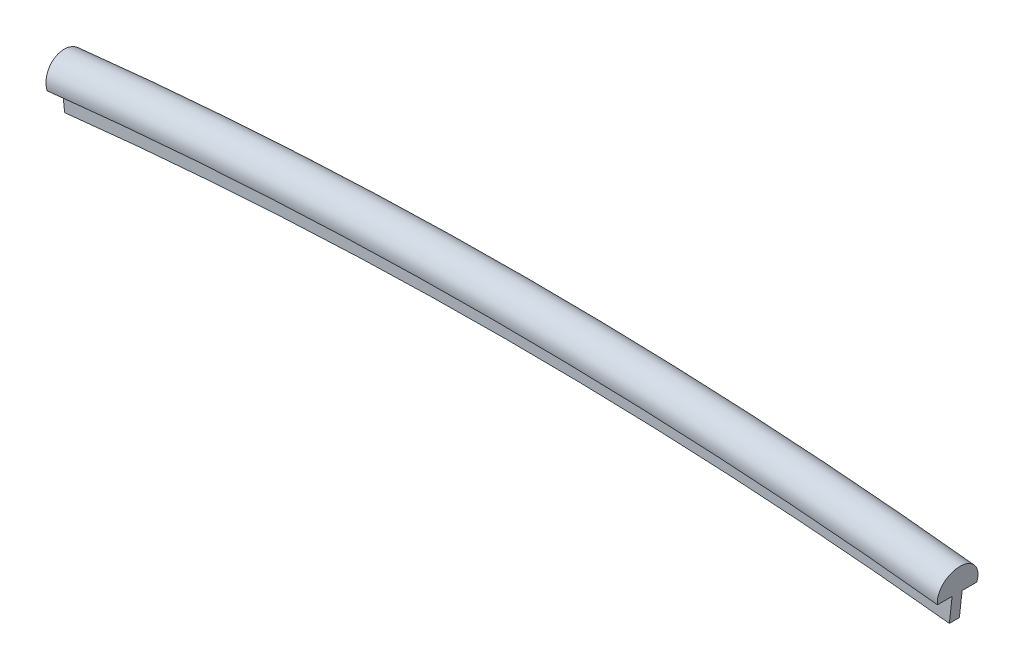
ISO-10303-21;
HEADER;
FILE_DESCRIPTION(('STEP AP214'),'2;1');
FILE_NAME('part.step','',(''),(''),'','','');
FILE_SCHEMA(('AUTOMOTIVE_DESIGN { 1 0 10303 214 1 1 1 1 }'));
ENDSEC;
DATA;
#1=APPLICATION_CONTEXT('core data for automotive mechanical design processes');
#2=APPLICATION_PROTOCOL_DEFINITION('international standard','automotive_design',2000,#1);
#3=PRODUCT_CONTEXT('',#1,'mechanical');
#4=PRODUCT('Part','Part','',(#3));
#5=PRODUCT_RELATED_PRODUCT_CATEGORY('part','',(#4));
#6=PRODUCT_DEFINITION_FORMATION('','',#4);
#7=PRODUCT_DEFINITION_CONTEXT('part definition',#1,'design');
#8=PRODUCT_DEFINITION('design','',#6,#7);
#9=PRODUCT_DEFINITION_SHAPE('','',#8);
#10=(LENGTH_UNIT() NAMED_UNIT(*) SI_UNIT(.MILLI.,.METRE.));
#11=(NAMED_UNIT(*) PLANE_ANGLE_UNIT() SI_UNIT($,.RADIAN.));
#12=(NAMED_UNIT(*) SI_UNIT($,.STERADIAN.) SOLID_ANGLE_UNIT());
#13=UNCERTAINTY_MEASURE_WITH_UNIT(LENGTH_MEASURE(1.E-05),#10,'distance_accuracy_value','');
#14=(GEOMETRIC_REPRESENTATION_CONTEXT(3) GLOBAL_UNCERTAINTY_ASSIGNED_CONTEXT((#13)) GLOBAL_UNIT_ASSIGNED_CONTEXT((#10,
#11,#12)) REPRESENTATION_CONTEXT('',''));
#15=CARTESIAN_POINT('',(0.,0.,0.));
#16=DIRECTION('',(0.,0.,1.));
#17=DIRECTION('',(1.,0.,0.));
#18=AXIS2_PLACEMENT_3D('',#15,#16,#17);
#19=CARTESIAN_POINT('',(0.,0.,70.5976415970385));
#20=DIRECTION('',(0.,0.,1.));
#21=DIRECTION('',(1.,0.,0.));
#22=AXIS2_PLACEMENT_3D('',#19,#20,#21);
#23=CYLINDRICAL_SURFACE('',#22,241.3);
#24=CARTESIAN_POINT('',(0.,0.,1.18));
#25=DIRECTION('',(0.,0.,1.));
#26=DIRECTION('',(1.,0.,0.));
#27=AXIS2_PLACEMENT_3D('',#24,#25,#26);
#28=CIRCLE('',#27,241.3);
#29=CARTESIAN_POINT('',(26.7201120049072,239.816024515555,1.18));
#30=VERTEX_POINT('',#29);
#31=CARTESIAN_POINT('',(-26.7201120049072,239.816024515555,1.18));
#32=VERTEX_POINT('',#31);
#33=EDGE_CURVE('E11',#30,#32,#28,.T.);
#34=ORIENTED_EDGE('',*,*,#33,.T.);
#35=DIRECTION('',(0.,0.,-1.));
#36=VECTOR('',#35,1.);
#37=CARTESIAN_POINT('',(-26.7201120049072,239.816024515555,1.18));
#38=LINE('',#37,#36);
#39=CARTESIAN_POINT('',(-26.7201120049072,239.816024515555,0.3));
#40=VERTEX_POINT('',#39);
#41=EDGE_CURVE('E103',#32,#40,#38,.T.);
#42=ORIENTED_EDGE('',*,*,#41,.T.);
#43=CARTESIAN_POINT('',(0.,0.,0.299999999999995));
#44=DIRECTION('',(0.,0.,1.));
#45=DIRECTION('',(1.,0.,0.));
#46=AXIS2_PLACEMENT_3D('',#43,#44,#45);
#47=CIRCLE('',#46,241.3);
#48=CARTESIAN_POINT('',(26.7201120049072,239.816024515555,0.3));
#49=VERTEX_POINT('',#48);
#50=EDGE_CURVE('E85',#49,#40,#47,.T.);
#51=ORIENTED_EDGE('',*,*,#50,.F.);
#52=DIRECTION('',(0.,0.,-1.));
#53=VECTOR('',#52,1.);
#54=CARTESIAN_POINT('',(26.7201120049072,239.816024515555,1.18));
#55=LINE('',#54,#53);
#56=EDGE_CURVE('E117',#30,#49,#55,.T.);
#57=ORIENTED_EDGE('',*,*,#56,.F.);
#58=EDGE_LOOP('',(#34,#42,#51,#57));
#59=FACE_BOUND('',#58,.T.);
#60=ADVANCED_FACE('F33',(#59),#23,.F.);
#61=CARTESIAN_POINT('',(0.,0.,0.));
#62=DIRECTION('',(0.,0.,1.));
#63=DIRECTION('',(1.,0.,0.));
#64=AXIS2_PLACEMENT_3D('',#61,#62,#63);
#65=TOROIDAL_SURFACE('',#64,241.586013989906,1.21416802890791);
#66=CARTESIAN_POINT('',(0.,0.,-1.18));
#67=DIRECTION('',(0.,0.,1.));
#68=DIRECTION('',(1.,0.,0.));
#69=AXIS2_PLACEMENT_3D('',#66,#67,#68);
#70=CIRCLE('',#69,241.3);
#71=CARTESIAN_POINT('',(26.7201120049072,239.816024515555,-1.18));
#72=VERTEX_POINT('',#71);
#73=CARTESIAN_POINT('',(-26.7201120049072,239.816024515555,-1.18));
#74=VERTEX_POINT('',#73);
#75=EDGE_CURVE('E41',#72,#74,#70,.T.);
#76=ORIENTED_EDGE('',*,*,#75,.T.);
#77=CARTESIAN_POINT('',(-26.7517834754636,240.100279542555,0.));
#78=DIRECTION('',(0.99385008087673,0.110733990903055,0.));
#79=DIRECTION('',(0.,0.,1.));
#80=AXIS2_PLACEMENT_3D('',#77,#78,#79);
#81=CIRCLE('',#80,1.21416802890791);
#82=EDGE_CURVE('E115',#74,#32,#81,.T.);
#83=ORIENTED_EDGE('',*,*,#82,.T.);
#84=ORIENTED_EDGE('',*,*,#33,.F.);
#85=CARTESIAN_POINT('',(26.7517834754636,240.100279542555,0.));
#86=DIRECTION('',(0.99385008087673,-0.110733990903055,0.));
#87=DIRECTION('',(0.,0.,1.));
#88=AXIS2_PLACEMENT_3D('',#85,#86,#87);
#89=CIRCLE('',#88,1.21416802890791);
#90=EDGE_CURVE('E97',#72,#30,#89,.T.);
#91=ORIENTED_EDGE('',*,*,#90,.F.);
#92=EDGE_LOOP('',(#76,#83,#84,#91));
#93=FACE_BOUND('',#92,.T.);
#94=ADVANCED_FACE('F35',(#93),#65,.T.);
#95=CARTESIAN_POINT('',(0.,0.,70.5976415970385));
#96=DIRECTION('',(0.,0.,1.));
#97=DIRECTION('',(1.,0.,0.));
#98=AXIS2_PLACEMENT_3D('',#95,#96,#97);
#99=CYLINDRICAL_SURFACE('',#98,241.3);
#100=CARTESIAN_POINT('',(0.,0.,-0.299999999999995));
#101=DIRECTION('',(0.,0.,1.));
#102=DIRECTION('',(1.,0.,0.));
#103=AXIS2_PLACEMENT_3D('',#100,#101,#102);
#104=CIRCLE('',#103,241.3);
#105=CARTESIAN_POINT('',(26.7201120049072,239.816024515555,-0.3));
#106=VERTEX_POINT('',#105);
#107=CARTESIAN_POINT('',(-26.7201120049072,239.816024515555,-0.3));
#108=VERTEX_POINT('',#107);
#109=EDGE_CURVE('E132',#106,#108,#104,.T.);
#110=ORIENTED_EDGE('',*,*,#109,.T.);
#111=DIRECTION('',(0.,0.,-1.));
#112=VECTOR('',#111,1.);
#113=CARTESIAN_POINT('',(-26.7201120049072,239.816024515555,-0.3));
#114=LINE('',#113,#112);
#115=EDGE_CURVE('E113',#108,#74,#114,.T.);
#116=ORIENTED_EDGE('',*,*,#115,.T.);
#117=ORIENTED_EDGE('',*,*,#75,.F.);
#118=DIRECTION('',(0.,0.,-1.));
#119=VECTOR('',#118,1.);
#120=CARTESIAN_POINT('',(26.7201120049072,239.816024515555,-0.3));
#121=LINE('',#120,#119);
#122=EDGE_CURVE('E125',#106,#72,#121,.T.);
#123=ORIENTED_EDGE('',*,*,#122,.F.);
#124=EDGE_LOOP('',(#110,#116,#117,#123));
#125=FACE_BOUND('',#124,.T.);
#126=ADVANCED_FACE('F134',(#125),#99,.F.);
#127=CARTESIAN_POINT('',(26.5540110185526,238.32524939424,-0.3));
#128=DIRECTION('',(0.,0.,1.));
#129=DIRECTION('',(1.,0.,0.));
#130=AXIS2_PLACEMENT_3D('',#127,#128,#129);
#131=PLANE('',#130);
#132=CARTESIAN_POINT('',(0.,0.,-0.299999999999995));
#133=DIRECTION('',(0.,0.,1.));
#134=DIRECTION('',(1.,0.,0.));
#135=AXIS2_PLACEMENT_3D('',#132,#133,#134);
#136=CIRCLE('',#135,239.8);
#137=CARTESIAN_POINT('',(26.5540110185526,238.32524939424,-0.3));
#138=VERTEX_POINT('',#137);
#139=CARTESIAN_POINT('',(-26.5540110185526,238.32524939424,-0.3));
#140=VERTEX_POINT('',#139);
#141=EDGE_CURVE('E129',#138,#140,#136,.T.);
#142=ORIENTED_EDGE('',*,*,#141,.T.);
#143=DIRECTION('',(-0.110733990903055,0.99385008087673,0.));
#144=VECTOR('',#143,1.);
#145=CARTESIAN_POINT('',(-26.5540110185526,238.32524939424,-0.3));
#146=LINE('',#145,#144);
#147=EDGE_CURVE('E110',#140,#108,#146,.T.);
#148=ORIENTED_EDGE('',*,*,#147,.T.);
#149=ORIENTED_EDGE('',*,*,#109,.F.);
#150=DIRECTION('',(0.110733990903055,0.99385008087673,0.));
#151=VECTOR('',#150,1.);
#152=CARTESIAN_POINT('',(26.5540110185526,238.32524939424,-0.3));
#153=LINE('',#152,#151);
#154=EDGE_CURVE('E122',#138,#106,#153,.T.);
#155=ORIENTED_EDGE('',*,*,#154,.F.);
#156=EDGE_LOOP('',(#142,#148,#149,#155));
#157=FACE_BOUND('',#156,.T.);
#158=ADVANCED_FACE('F136',(#157),#131,.F.);
#159=CARTESIAN_POINT('',(0.,0.,70.5976415970385));
#160=DIRECTION('',(0.,0.,1.));
#161=DIRECTION('',(1.,0.,0.));
#162=AXIS2_PLACEMENT_3D('',#159,#160,#161);
#163=CYLINDRICAL_SURFACE('',#162,239.8);
#164=CARTESIAN_POINT('',(0.,0.,0.299999999999995));
#165=DIRECTION('',(0.,0.,1.));
#166=DIRECTION('',(1.,0.,0.));
#167=AXIS2_PLACEMENT_3D('',#164,#165,#166);
#168=CIRCLE('',#167,239.8);
#169=CARTESIAN_POINT('',(26.5540110185526,238.32524939424,0.3));
#170=VERTEX_POINT('',#169);
#171=CARTESIAN_POINT('',(-26.5540110185526,238.32524939424,0.3));
#172=VERTEX_POINT('',#171);
#173=EDGE_CURVE('E96',#170,#172,#168,.T.);
#174=ORIENTED_EDGE('',*,*,#173,.T.);
#175=DIRECTION('',(0.,0.,-1.));
#176=VECTOR('',#175,1.);
#177=CARTESIAN_POINT('',(-26.5540110185526,238.32524939424,0.));
#178=LINE('',#177,#176);
#179=EDGE_CURVE('E105',#172,#140,#178,.T.);
#180=ORIENTED_EDGE('',*,*,#179,.T.);
#181=ORIENTED_EDGE('',*,*,#141,.F.);
#182=DIRECTION('',(0.,0.,-1.));
#183=VECTOR('',#182,1.);
#184=CARTESIAN_POINT('',(26.5540110185526,238.32524939424,0.));
#185=LINE('',#184,#183);
#186=EDGE_CURVE('E120',#170,#138,#185,.T.);
#187=ORIENTED_EDGE('',*,*,#186,.F.);
#188=EDGE_LOOP('',(#174,#180,#181,#187));
#189=FACE_BOUND('',#188,.T.);
#190=ADVANCED_FACE('F141',(#189),#163,.F.);
#191=CARTESIAN_POINT('',(26.5540110185526,238.32524939424,0.3));
#192=DIRECTION('',(0.,0.,-1.));
#193=DIRECTION('',(-1.,0.,0.));
#194=AXIS2_PLACEMENT_3D('',#191,#192,#193);
#195=PLANE('',#194);
#196=DIRECTION('',(-0.110733990903055,-0.99385008087673,0.));
#197=VECTOR('',#196,1.);
#198=CARTESIAN_POINT('',(26.5540110185526,238.32524939424,0.3));
#199=LINE('',#198,#197);
#200=EDGE_CURVE('E91',#49,#170,#199,.T.);
#201=ORIENTED_EDGE('',*,*,#200,.F.);
#202=ORIENTED_EDGE('',*,*,#50,.T.);
#203=DIRECTION('',(0.110733990903055,-0.99385008087673,0.));
#204=VECTOR('',#203,1.);
#205=CARTESIAN_POINT('',(-26.5540110185526,238.32524939424,0.3));
#206=LINE('',#205,#204);
#207=EDGE_CURVE('E88',#40,#172,#206,.T.);
#208=ORIENTED_EDGE('',*,*,#207,.T.);
#209=ORIENTED_EDGE('',*,*,#173,.F.);
#210=EDGE_LOOP('',(#201,#202,#208,#209));
#211=FACE_BOUND('',#210,.T.);
#212=ADVANCED_FACE('F87',(#211),#195,.F.);
#213=CARTESIAN_POINT('',(26.7517834754636,240.100279542555,0.));
#214=DIRECTION('',(-0.99385008087673,0.110733990903055,0.));
#215=DIRECTION('',(0.,0.,1.));
#216=AXIS2_PLACEMENT_3D('',#213,#214,#215);
#217=PLANE('',#216);
#218=ORIENTED_EDGE('',*,*,#56,.T.);
#219=ORIENTED_EDGE('',*,*,#200,.T.);
#220=ORIENTED_EDGE('',*,*,#186,.T.);
#221=ORIENTED_EDGE('',*,*,#154,.T.);
#222=ORIENTED_EDGE('',*,*,#122,.T.);
#223=ORIENTED_EDGE('',*,*,#90,.T.);
#224=EDGE_LOOP('',(#218,#219,#220,#221,#222,#223));
#225=FACE_BOUND('',#224,.T.);
#226=ADVANCED_FACE('F143',(#225),#217,.F.);
#227=CARTESIAN_POINT('',(-26.7517834754636,240.100279542555,0.));
#228=DIRECTION('',(-0.99385008087673,-0.110733990903055,0.));
#229=DIRECTION('',(0.,0.,1.));
#230=AXIS2_PLACEMENT_3D('',#227,#228,#229);
#231=PLANE('',#230);
#232=ORIENTED_EDGE('',*,*,#41,.F.);
#233=ORIENTED_EDGE('',*,*,#82,.F.);
#234=ORIENTED_EDGE('',*,*,#115,.F.);
#235=ORIENTED_EDGE('',*,*,#147,.F.);
#236=ORIENTED_EDGE('',*,*,#179,.F.);
#237=ORIENTED_EDGE('',*,*,#207,.F.);
#238=EDGE_LOOP('',(#232,#233,#234,#235,#236,#237));
#239=FACE_BOUND('',#238,.T.);
#240=ADVANCED_FACE('F101',(#239),#231,.T.);
#241=CLOSED_SHELL('',(#60,#94,#126,#158,#190,#212,#226,#240));
#242=MANIFOLD_SOLID_BREP('B2',#241);
#243=ADVANCED_BREP_SHAPE_REPRESENTATION('',(#18,#242),#14);
#244=SHAPE_DEFINITION_REPRESENTATION(#9,#243);
ENDSEC;
END-ISO-10303-21;
